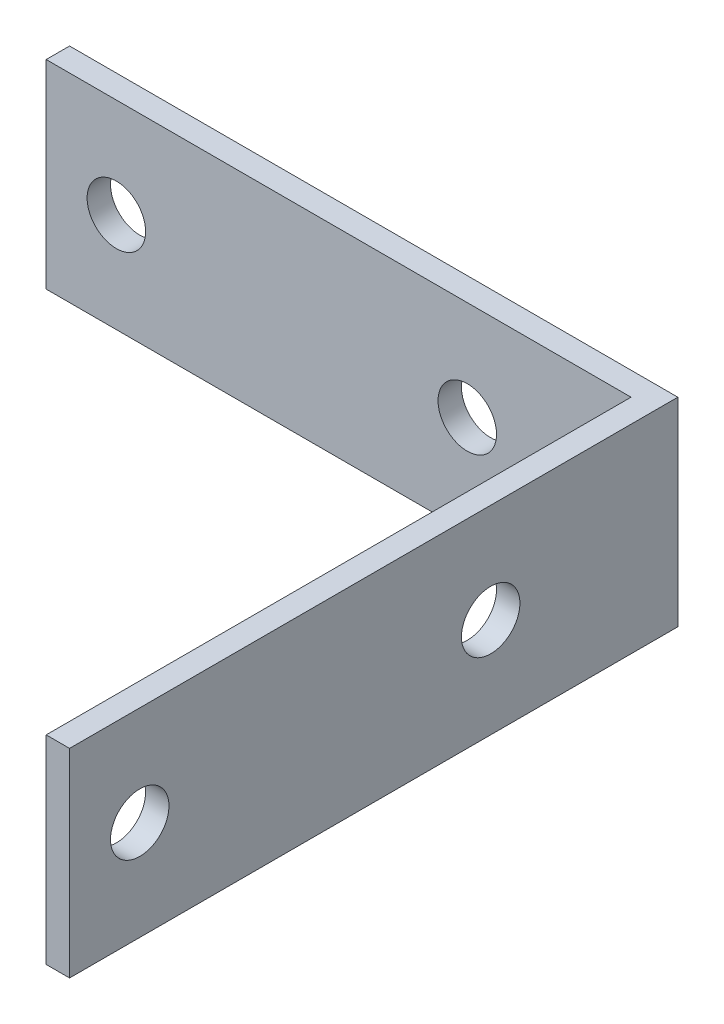
ISO-10303-21;
HEADER;
FILE_DESCRIPTION(('STEP AP214'),'2;1');
FILE_NAME('part.step','',(''),(''),'','','');
FILE_SCHEMA(('AUTOMOTIVE_DESIGN { 1 0 10303 214 1 1 1 1 }'));
ENDSEC;
DATA;
#1=APPLICATION_CONTEXT('core data for automotive mechanical design processes');
#2=APPLICATION_PROTOCOL_DEFINITION('international standard','automotive_design',2000,#1);
#3=PRODUCT_CONTEXT('',#1,'mechanical');
#4=PRODUCT('Part','Part','',(#3));
#5=PRODUCT_RELATED_PRODUCT_CATEGORY('part','',(#4));
#6=PRODUCT_DEFINITION_FORMATION('','',#4);
#7=PRODUCT_DEFINITION_CONTEXT('part definition',#1,'design');
#8=PRODUCT_DEFINITION('design','',#6,#7);
#9=PRODUCT_DEFINITION_SHAPE('','',#8);
#10=(LENGTH_UNIT() NAMED_UNIT(*) SI_UNIT(.MILLI.,.METRE.));
#11=(NAMED_UNIT(*) PLANE_ANGLE_UNIT() SI_UNIT($,.RADIAN.));
#12=(NAMED_UNIT(*) SI_UNIT($,.STERADIAN.) SOLID_ANGLE_UNIT());
#13=UNCERTAINTY_MEASURE_WITH_UNIT(LENGTH_MEASURE(1.E-05),#10,'distance_accuracy_value','');
#14=(GEOMETRIC_REPRESENTATION_CONTEXT(3) GLOBAL_UNCERTAINTY_ASSIGNED_CONTEXT((#13)) GLOBAL_UNIT_ASSIGNED_CONTEXT((#10,
#11,#12)) REPRESENTATION_CONTEXT('',''));
#15=CARTESIAN_POINT('',(0.,0.,0.));
#16=DIRECTION('',(0.,0.,1.));
#17=DIRECTION('',(1.,0.,0.));
#18=AXIS2_PLACEMENT_3D('',#15,#16,#17);
#19=CARTESIAN_POINT('',(26.,8.5,2.));
#20=DIRECTION('',(-1.,0.,0.));
#21=DIRECTION('',(0.,0.,1.));
#22=AXIS2_PLACEMENT_3D('',#19,#20,#21);
#23=PLANE('',#22);
#24=CARTESIAN_POINT('',(26.,0.,16.));
#25=DIRECTION('',(-1.,0.,0.));
#26=DIRECTION('',(0.,0.,1.));
#27=AXIS2_PLACEMENT_3D('',#24,#25,#26);
#28=CIRCLE('',#27,2.5);
#29=CARTESIAN_POINT('',(26.,0.,18.5));
#30=VERTEX_POINT('',#29);
#31=EDGE_CURVE('E173',#30,#30,#28,.T.);
#32=ORIENTED_EDGE('',*,*,#31,.T.);
#33=EDGE_LOOP('',(#32));
#34=FACE_BOUND('',#33,.T.);
#35=CARTESIAN_POINT('',(26.,0.,46.));
#36=DIRECTION('',(-1.,0.,0.));
#37=DIRECTION('',(0.,0.,1.));
#38=AXIS2_PLACEMENT_3D('',#35,#36,#37);
#39=CIRCLE('',#38,2.5);
#40=CARTESIAN_POINT('',(26.,0.,48.5));
#41=VERTEX_POINT('',#40);
#42=EDGE_CURVE('E176',#41,#41,#39,.T.);
#43=ORIENTED_EDGE('',*,*,#42,.T.);
#44=EDGE_LOOP('',(#43));
#45=FACE_BOUND('',#44,.T.);
#46=DIRECTION('',(0.,1.,0.));
#47=VECTOR('',#46,1.);
#48=CARTESIAN_POINT('',(26.,8.5,0.));
#49=LINE('',#48,#47);
#50=CARTESIAN_POINT('',(26.,-8.5,0.));
#51=VERTEX_POINT('',#50);
#52=CARTESIAN_POINT('',(26.,8.5,0.));
#53=VERTEX_POINT('',#52);
#54=EDGE_CURVE('E92',#51,#53,#49,.T.);
#55=ORIENTED_EDGE('',*,*,#54,.T.);
#56=DIRECTION('',(0.,0.,-1.));
#57=VECTOR('',#56,1.);
#58=CARTESIAN_POINT('',(26.,8.5,2.));
#59=LINE('',#58,#57);
#60=CARTESIAN_POINT('',(26.,8.5,52.));
#61=VERTEX_POINT('',#60);
#62=EDGE_CURVE('E11',#61,#53,#59,.T.);
#63=ORIENTED_EDGE('',*,*,#62,.F.);
#64=DIRECTION('',(0.,1.,0.));
#65=VECTOR('',#64,1.);
#66=CARTESIAN_POINT('',(26.,8.5,52.));
#67=LINE('',#66,#65);
#68=CARTESIAN_POINT('',(26.,-8.5,52.));
#69=VERTEX_POINT('',#68);
#70=EDGE_CURVE('E94',#69,#61,#67,.T.);
#71=ORIENTED_EDGE('',*,*,#70,.F.);
#72=DIRECTION('',(0.,0.,-1.));
#73=VECTOR('',#72,1.);
#74=CARTESIAN_POINT('',(26.,-8.5,2.));
#75=LINE('',#74,#73);
#76=EDGE_CURVE('E78',#69,#51,#75,.T.);
#77=ORIENTED_EDGE('',*,*,#76,.T.);
#78=EDGE_LOOP('',(#55,#63,#71,#77));
#79=FACE_BOUND('',#78,.T.);
#80=ADVANCED_FACE('F32',(#34,#45,#79),#23,.F.);
#81=CARTESIAN_POINT('',(-26.,8.5,2.));
#82=DIRECTION('',(0.,-1.,0.));
#83=DIRECTION('',(0.,0.,-1.));
#84=AXIS2_PLACEMENT_3D('',#81,#82,#83);
#85=PLANE('',#84);
#86=DIRECTION('',(-1.,0.,0.));
#87=VECTOR('',#86,1.);
#88=CARTESIAN_POINT('',(-26.,8.5,0.));
#89=LINE('',#88,#87);
#90=CARTESIAN_POINT('',(-26.,8.5,0.));
#91=VERTEX_POINT('',#90);
#92=EDGE_CURVE('E98',#53,#91,#89,.T.);
#93=ORIENTED_EDGE('',*,*,#92,.T.);
#94=DIRECTION('',(0.,0.,-1.));
#95=VECTOR('',#94,1.);
#96=CARTESIAN_POINT('',(-26.,8.5,2.));
#97=LINE('',#96,#95);
#98=CARTESIAN_POINT('',(-26.,8.5,2.));
#99=VERTEX_POINT('',#98);
#100=EDGE_CURVE('E40',#99,#91,#97,.T.);
#101=ORIENTED_EDGE('',*,*,#100,.F.);
#102=DIRECTION('',(-1.,0.,0.));
#103=VECTOR('',#102,1.);
#104=CARTESIAN_POINT('',(-26.,8.5,2.));
#105=LINE('',#104,#103);
#106=CARTESIAN_POINT('',(24.,8.5,2.));
#107=VERTEX_POINT('',#106);
#108=EDGE_CURVE('E85',#107,#99,#105,.T.);
#109=ORIENTED_EDGE('',*,*,#108,.F.);
#110=DIRECTION('',(0.,0.,-1.));
#111=VECTOR('',#110,1.);
#112=CARTESIAN_POINT('',(24.,8.5,52.));
#113=LINE('',#112,#111);
#114=CARTESIAN_POINT('',(24.,8.5,52.));
#115=VERTEX_POINT('',#114);
#116=EDGE_CURVE('E99',#115,#107,#113,.T.);
#117=ORIENTED_EDGE('',*,*,#116,.F.);
#118=DIRECTION('',(-1.,0.,0.));
#119=VECTOR('',#118,1.);
#120=CARTESIAN_POINT('',(26.,8.5,52.));
#121=LINE('',#120,#119);
#122=EDGE_CURVE('E127',#61,#115,#121,.T.);
#123=ORIENTED_EDGE('',*,*,#122,.F.);
#124=ORIENTED_EDGE('',*,*,#62,.T.);
#125=EDGE_LOOP('',(#93,#101,#109,#117,#123,#124));
#126=FACE_BOUND('',#125,.T.);
#127=ADVANCED_FACE('F155',(#126),#85,.F.);
#128=CARTESIAN_POINT('',(-26.,8.5,2.));
#129=DIRECTION('',(1.,0.,0.));
#130=DIRECTION('',(0.,1.,0.));
#131=AXIS2_PLACEMENT_3D('',#128,#129,#130);
#132=PLANE('',#131);
#133=DIRECTION('',(0.,-1.,0.));
#134=VECTOR('',#133,1.);
#135=CARTESIAN_POINT('',(-26.,8.5,0.));
#136=LINE('',#135,#134);
#137=CARTESIAN_POINT('',(-26.,-8.5,0.));
#138=VERTEX_POINT('',#137);
#139=EDGE_CURVE('E86',#91,#138,#136,.T.);
#140=ORIENTED_EDGE('',*,*,#139,.T.);
#141=DIRECTION('',(0.,0.,-1.));
#142=VECTOR('',#141,1.);
#143=CARTESIAN_POINT('',(-26.,-8.5,2.));
#144=LINE('',#143,#142);
#145=CARTESIAN_POINT('',(-26.,-8.5,2.));
#146=VERTEX_POINT('',#145);
#147=EDGE_CURVE('E81',#146,#138,#144,.T.);
#148=ORIENTED_EDGE('',*,*,#147,.F.);
#149=DIRECTION('',(0.,-1.,0.));
#150=VECTOR('',#149,1.);
#151=CARTESIAN_POINT('',(-26.,8.5,2.));
#152=LINE('',#151,#150);
#153=EDGE_CURVE('E54',#99,#146,#152,.T.);
#154=ORIENTED_EDGE('',*,*,#153,.F.);
#155=ORIENTED_EDGE('',*,*,#100,.T.);
#156=EDGE_LOOP('',(#140,#148,#154,#155));
#157=FACE_BOUND('',#156,.T.);
#158=ADVANCED_FACE('F158',(#157),#132,.F.);
#159=CARTESIAN_POINT('',(-26.,-8.5,2.));
#160=DIRECTION('',(0.,1.,0.));
#161=DIRECTION('',(0.,0.,1.));
#162=AXIS2_PLACEMENT_3D('',#159,#160,#161);
#163=PLANE('',#162);
#164=DIRECTION('',(1.,0.,0.));
#165=VECTOR('',#164,1.);
#166=CARTESIAN_POINT('',(-26.,-8.5,0.));
#167=LINE('',#166,#165);
#168=EDGE_CURVE('E74',#138,#51,#167,.T.);
#169=ORIENTED_EDGE('',*,*,#168,.T.);
#170=ORIENTED_EDGE('',*,*,#76,.F.);
#171=DIRECTION('',(1.,0.,0.));
#172=VECTOR('',#171,1.);
#173=CARTESIAN_POINT('',(26.,-8.5,52.));
#174=LINE('',#173,#172);
#175=CARTESIAN_POINT('',(24.,-8.5,52.));
#176=VERTEX_POINT('',#175);
#177=EDGE_CURVE('E133',#176,#69,#174,.T.);
#178=ORIENTED_EDGE('',*,*,#177,.F.);
#179=DIRECTION('',(0.,0.,-1.));
#180=VECTOR('',#179,1.);
#181=CARTESIAN_POINT('',(24.,-8.5,52.));
#182=LINE('',#181,#180);
#183=CARTESIAN_POINT('',(24.,-8.5,2.));
#184=VERTEX_POINT('',#183);
#185=EDGE_CURVE('E103',#176,#184,#182,.T.);
#186=ORIENTED_EDGE('',*,*,#185,.T.);
#187=DIRECTION('',(1.,0.,0.));
#188=VECTOR('',#187,1.);
#189=CARTESIAN_POINT('',(-26.,-8.5,2.));
#190=LINE('',#189,#188);
#191=EDGE_CURVE('E95',#146,#184,#190,.T.);
#192=ORIENTED_EDGE('',*,*,#191,.F.);
#193=ORIENTED_EDGE('',*,*,#147,.T.);
#194=EDGE_LOOP('',(#169,#170,#178,#186,#192,#193));
#195=FACE_BOUND('',#194,.T.);
#196=ADVANCED_FACE('F76',(#195),#163,.F.);
#197=CARTESIAN_POINT('',(0.,0.,2.));
#198=DIRECTION('',(0.,0.,1.));
#199=DIRECTION('',(1.,0.,0.));
#200=AXIS2_PLACEMENT_3D('',#197,#198,#199);
#201=PLANE('',#200);
#202=CARTESIAN_POINT('',(9.99999999999999,0.,2.));
#203=DIRECTION('',(0.,0.,1.));
#204=DIRECTION('',(1.,0.,0.));
#205=AXIS2_PLACEMENT_3D('',#202,#203,#204);
#206=CIRCLE('',#205,2.5);
#207=CARTESIAN_POINT('',(12.5,0.,2.));
#208=VERTEX_POINT('',#207);
#209=EDGE_CURVE('E122',#208,#208,#206,.T.);
#210=ORIENTED_EDGE('',*,*,#209,.F.);
#211=EDGE_LOOP('',(#210));
#212=FACE_BOUND('',#211,.T.);
#213=CARTESIAN_POINT('',(-20.,0.,2.));
#214=DIRECTION('',(0.,0.,1.));
#215=DIRECTION('',(1.,0.,0.));
#216=AXIS2_PLACEMENT_3D('',#213,#214,#215);
#217=CIRCLE('',#216,2.5);
#218=CARTESIAN_POINT('',(-17.5,0.,2.));
#219=VERTEX_POINT('',#218);
#220=EDGE_CURVE('E113',#219,#219,#217,.T.);
#221=ORIENTED_EDGE('',*,*,#220,.F.);
#222=EDGE_LOOP('',(#221));
#223=FACE_BOUND('',#222,.T.);
#224=DIRECTION('',(0.,-1.,0.));
#225=VECTOR('',#224,1.);
#226=CARTESIAN_POINT('',(24.,8.5,2.));
#227=LINE('',#226,#225);
#228=EDGE_CURVE('E48',#107,#184,#227,.T.);
#229=ORIENTED_EDGE('',*,*,#228,.F.);
#230=ORIENTED_EDGE('',*,*,#108,.T.);
#231=ORIENTED_EDGE('',*,*,#153,.T.);
#232=ORIENTED_EDGE('',*,*,#191,.T.);
#233=EDGE_LOOP('',(#229,#230,#231,#232));
#234=FACE_BOUND('',#233,.T.);
#235=ADVANCED_FACE('F138',(#212,#223,#234),#201,.T.);
#236=CARTESIAN_POINT('',(0.,0.,0.));
#237=DIRECTION('',(0.,0.,1.));
#238=DIRECTION('',(1.,0.,0.));
#239=AXIS2_PLACEMENT_3D('',#236,#237,#238);
#240=PLANE('',#239);
#241=CARTESIAN_POINT('',(9.99999999999999,0.,0.));
#242=DIRECTION('',(0.,0.,1.));
#243=DIRECTION('',(1.,0.,0.));
#244=AXIS2_PLACEMENT_3D('',#241,#242,#243);
#245=CIRCLE('',#244,2.5);
#246=CARTESIAN_POINT('',(12.5,0.,0.));
#247=VERTEX_POINT('',#246);
#248=EDGE_CURVE('E35',#247,#247,#245,.T.);
#249=ORIENTED_EDGE('',*,*,#248,.T.);
#250=EDGE_LOOP('',(#249));
#251=FACE_BOUND('',#250,.T.);
#252=CARTESIAN_POINT('',(-20.,0.,0.));
#253=DIRECTION('',(0.,0.,1.));
#254=DIRECTION('',(1.,0.,0.));
#255=AXIS2_PLACEMENT_3D('',#252,#253,#254);
#256=CIRCLE('',#255,2.5);
#257=CARTESIAN_POINT('',(-17.5,0.,0.));
#258=VERTEX_POINT('',#257);
#259=EDGE_CURVE('E111',#258,#258,#256,.T.);
#260=ORIENTED_EDGE('',*,*,#259,.T.);
#261=EDGE_LOOP('',(#260));
#262=FACE_BOUND('',#261,.T.);
#263=ORIENTED_EDGE('',*,*,#54,.F.);
#264=ORIENTED_EDGE('',*,*,#168,.F.);
#265=ORIENTED_EDGE('',*,*,#139,.F.);
#266=ORIENTED_EDGE('',*,*,#92,.F.);
#267=EDGE_LOOP('',(#263,#264,#265,#266));
#268=FACE_BOUND('',#267,.T.);
#269=ADVANCED_FACE('F97',(#251,#262,#268),#240,.F.);
#270=CARTESIAN_POINT('',(24.,8.5,52.));
#271=DIRECTION('',(1.,0.,0.));
#272=DIRECTION('',(0.,0.,-1.));
#273=AXIS2_PLACEMENT_3D('',#270,#271,#272);
#274=PLANE('',#273);
#275=CARTESIAN_POINT('',(24.,0.,16.));
#276=DIRECTION('',(-1.,0.,0.));
#277=DIRECTION('',(0.,0.,1.));
#278=AXIS2_PLACEMENT_3D('',#275,#276,#277);
#279=CIRCLE('',#278,2.5);
#280=CARTESIAN_POINT('',(24.,0.,18.5));
#281=VERTEX_POINT('',#280);
#282=EDGE_CURVE('E184',#281,#281,#279,.T.);
#283=ORIENTED_EDGE('',*,*,#282,.F.);
#284=EDGE_LOOP('',(#283));
#285=FACE_BOUND('',#284,.T.);
#286=CARTESIAN_POINT('',(24.,0.,46.));
#287=DIRECTION('',(-1.,0.,0.));
#288=DIRECTION('',(0.,0.,1.));
#289=AXIS2_PLACEMENT_3D('',#286,#287,#288);
#290=CIRCLE('',#289,2.5);
#291=CARTESIAN_POINT('',(24.,0.,48.5));
#292=VERTEX_POINT('',#291);
#293=EDGE_CURVE('E178',#292,#292,#290,.T.);
#294=ORIENTED_EDGE('',*,*,#293,.F.);
#295=EDGE_LOOP('',(#294));
#296=FACE_BOUND('',#295,.T.);
#297=ORIENTED_EDGE('',*,*,#228,.T.);
#298=ORIENTED_EDGE('',*,*,#185,.F.);
#299=DIRECTION('',(0.,-1.,0.));
#300=VECTOR('',#299,1.);
#301=CARTESIAN_POINT('',(24.,8.5,52.));
#302=LINE('',#301,#300);
#303=EDGE_CURVE('E130',#115,#176,#302,.T.);
#304=ORIENTED_EDGE('',*,*,#303,.F.);
#305=ORIENTED_EDGE('',*,*,#116,.T.);
#306=EDGE_LOOP('',(#297,#298,#304,#305));
#307=FACE_BOUND('',#306,.T.);
#308=ADVANCED_FACE('F142',(#285,#296,#307),#274,.F.);
#309=CARTESIAN_POINT('',(0.,0.,52.));
#310=DIRECTION('',(0.,0.,-1.));
#311=DIRECTION('',(-1.,0.,0.));
#312=AXIS2_PLACEMENT_3D('',#309,#310,#311);
#313=PLANE('',#312);
#314=ORIENTED_EDGE('',*,*,#70,.T.);
#315=ORIENTED_EDGE('',*,*,#122,.T.);
#316=ORIENTED_EDGE('',*,*,#303,.T.);
#317=ORIENTED_EDGE('',*,*,#177,.T.);
#318=EDGE_LOOP('',(#314,#315,#316,#317));
#319=FACE_BOUND('',#318,.T.);
#320=ADVANCED_FACE('F149',(#319),#313,.F.);
#321=CARTESIAN_POINT('',(-20.,0.,-48.));
#322=DIRECTION('',(0.,0.,1.));
#323=DIRECTION('',(1.,0.,0.));
#324=AXIS2_PLACEMENT_3D('',#321,#322,#323);
#325=CYLINDRICAL_SURFACE('',#324,2.5);
#326=ORIENTED_EDGE('',*,*,#220,.T.);
#327=EDGE_LOOP('',(#326));
#328=FACE_BOUND('',#327,.T.);
#329=ORIENTED_EDGE('',*,*,#259,.F.);
#330=EDGE_LOOP('',(#329));
#331=FACE_BOUND('',#330,.T.);
#332=ADVANCED_FACE('F205',(#328,#331),#325,.F.);
#333=CARTESIAN_POINT('',(9.99999999999999,0.,-48.));
#334=DIRECTION('',(0.,0.,1.));
#335=DIRECTION('',(1.,0.,0.));
#336=AXIS2_PLACEMENT_3D('',#333,#334,#335);
#337=CYLINDRICAL_SURFACE('',#336,2.5);
#338=ORIENTED_EDGE('',*,*,#209,.T.);
#339=EDGE_LOOP('',(#338));
#340=FACE_BOUND('',#339,.T.);
#341=ORIENTED_EDGE('',*,*,#248,.F.);
#342=EDGE_LOOP('',(#341));
#343=FACE_BOUND('',#342,.T.);
#344=ADVANCED_FACE('F198',(#340,#343),#337,.F.);
#345=CARTESIAN_POINT('',(74.,0.,46.));
#346=DIRECTION('',(-1.,0.,0.));
#347=DIRECTION('',(0.,0.,1.));
#348=AXIS2_PLACEMENT_3D('',#345,#346,#347);
#349=CYLINDRICAL_SURFACE('',#348,2.5);
#350=ORIENTED_EDGE('',*,*,#293,.T.);
#351=EDGE_LOOP('',(#350));
#352=FACE_BOUND('',#351,.T.);
#353=ORIENTED_EDGE('',*,*,#42,.F.);
#354=EDGE_LOOP('',(#353));
#355=FACE_BOUND('',#354,.T.);
#356=ADVANCED_FACE('F196',(#352,#355),#349,.F.);
#357=CARTESIAN_POINT('',(74.,0.,16.));
#358=DIRECTION('',(-1.,0.,0.));
#359=DIRECTION('',(0.,0.,1.));
#360=AXIS2_PLACEMENT_3D('',#357,#358,#359);
#361=CYLINDRICAL_SURFACE('',#360,2.5);
#362=ORIENTED_EDGE('',*,*,#282,.T.);
#363=EDGE_LOOP('',(#362));
#364=FACE_BOUND('',#363,.T.);
#365=ORIENTED_EDGE('',*,*,#31,.F.);
#366=EDGE_LOOP('',(#365));
#367=FACE_BOUND('',#366,.T.);
#368=ADVANCED_FACE('F188',(#364,#367),#361,.F.);
#369=CLOSED_SHELL('',(#80,#127,#158,#196,#235,#269,#308,#320,#332,#344,#356,#368));
#370=MANIFOLD_SOLID_BREP('B2',#369);
#371=ADVANCED_BREP_SHAPE_REPRESENTATION('',(#18,#370),#14);
#372=SHAPE_DEFINITION_REPRESENTATION(#9,#371);
ENDSEC;
END-ISO-10303-21;
